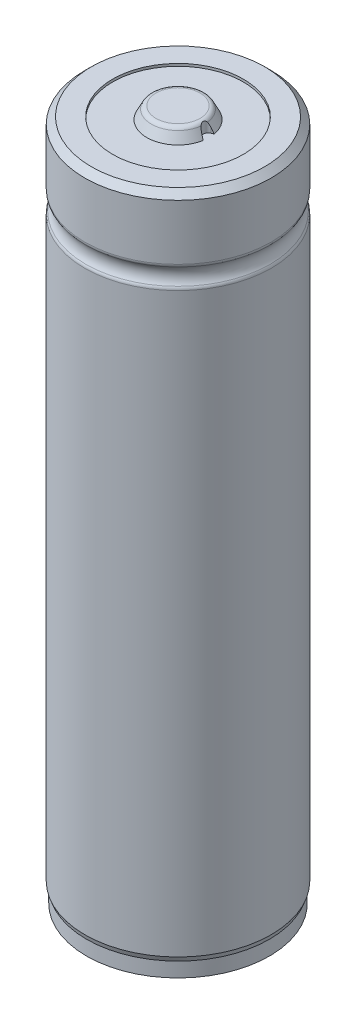
ISO-10303-21;
HEADER;
FILE_DESCRIPTION(('STEP AP214'),'2;1');
FILE_NAME('part.step','',(''),(''),'','','');
FILE_SCHEMA(('AUTOMOTIVE_DESIGN { 1 0 10303 214 1 1 1 1 }'));
ENDSEC;
DATA;
#1=APPLICATION_CONTEXT('core data for automotive mechanical design processes');
#2=APPLICATION_PROTOCOL_DEFINITION('international standard','automotive_design',2000,#1);
#3=PRODUCT_CONTEXT('',#1,'mechanical');
#4=PRODUCT('Part','Part','',(#3));
#5=PRODUCT_RELATED_PRODUCT_CATEGORY('part','',(#4));
#6=PRODUCT_DEFINITION_FORMATION('','',#4);
#7=PRODUCT_DEFINITION_CONTEXT('part definition',#1,'design');
#8=PRODUCT_DEFINITION('design','',#6,#7);
#9=PRODUCT_DEFINITION_SHAPE('','',#8);
#10=(LENGTH_UNIT() NAMED_UNIT(*) SI_UNIT(.MILLI.,.METRE.));
#11=(NAMED_UNIT(*) PLANE_ANGLE_UNIT() SI_UNIT($,.RADIAN.));
#12=(NAMED_UNIT(*) SI_UNIT($,.STERADIAN.) SOLID_ANGLE_UNIT());
#13=UNCERTAINTY_MEASURE_WITH_UNIT(LENGTH_MEASURE(1.E-05),#10,'distance_accuracy_value','');
#14=(GEOMETRIC_REPRESENTATION_CONTEXT(3) GLOBAL_UNCERTAINTY_ASSIGNED_CONTEXT((#13)) GLOBAL_UNIT_ASSIGNED_CONTEXT((#10,
#11,#12)) REPRESENTATION_CONTEXT('',''));
#15=CARTESIAN_POINT('',(0.,0.,0.));
#16=DIRECTION('',(0.,0.,1.));
#17=DIRECTION('',(1.,0.,0.));
#18=AXIS2_PLACEMENT_3D('',#15,#16,#17);
#19=CARTESIAN_POINT('',(0.,68.75,0.));
#20=DIRECTION('',(0.,-1.,0.));
#21=DIRECTION('',(0.,0.,-1.));
#22=AXIS2_PLACEMENT_3D('',#19,#20,#21);
#23=CONICAL_SURFACE('',#22,2.5,0.463647609000804);
#24=CARTESIAN_POINT('',(-2.83028946375603,68.0117993124896,0.470317269391405));
#25=CARTESIAN_POINT('',(-2.81138802981694,68.0513239860967,0.463469626931302));
#26=CARTESIAN_POINT('',(-2.79271843805804,68.0907780312502,0.455469184730546));
#27=CARTESIAN_POINT('',(-2.75602281370867,68.1691338817233,0.436923937337304));
#28=CARTESIAN_POINT('',(-2.73799405521771,68.208037453108,0.42639190981715));
#29=CARTESIAN_POINT('',(-2.70256382827487,68.2852928231361,0.40247751167182));
#30=CARTESIAN_POINT('',(-2.68516262751072,68.323644382221,0.389093941135765));
#31=CARTESIAN_POINT('',(-2.65962279932329,68.3805205674553,0.366433650471559));
#32=CARTESIAN_POINT('',(-2.65118286279864,68.3994170352769,0.358426192609236));
#33=CARTESIAN_POINT('',(-2.63453621746898,68.4368821136596,0.341432913478595));
#34=CARTESIAN_POINT('',(-2.62632963178436,68.4554505492575,0.332446587391));
#35=CARTESIAN_POINT('',(-2.61825894614491,68.4738067977492,0.322914489922038));
#36=B_SPLINE_CURVE_WITH_KNOTS('',3,(#24,#25,#26,#27,#28,#29,#30,#31,#32,#33,#34,#35),
.UNSPECIFIED.,.F.,.F.,(4,2,2,2,2,4),(0.,0.133037109670133,0.265416342601513,0.397851390263327,
0.464401396736106,0.530985888160825),.UNSPECIFIED.);
#37=CARTESIAN_POINT('',(-2.83008946375603,68.0122175773087,0.47024505278981));
#38=VERTEX_POINT('',#37);
#39=CARTESIAN_POINT('',(-2.61834688436459,68.47360679775,0.323018419483759));
#40=VERTEX_POINT('',#39);
#41=EDGE_CURVE('E66',#38,#40,#36,.T.);
#42=ORIENTED_EDGE('',*,*,#41,.F.);
#43=CARTESIAN_POINT('',(-3.05091495987479,67.5498,0.550034469476448));
#44=CARTESIAN_POINT('',(-3.0141129104437,67.6269584933717,0.536737028245294));
#45=CARTESIAN_POINT('',(-2.97729309442779,67.7041073947059,0.5234331675315));
#46=CARTESIAN_POINT('',(-2.90361792905504,67.858386013658,0.496812607076733));
#47=CARTESIAN_POINT('',(-2.86676257969803,67.9355157312758,0.483495907335699));
#48=CARTESIAN_POINT('',(-2.82988946375604,68.0126358568561,0.470172788111966));
#49=B_SPLINE_CURVE_WITH_KNOTS('',3,(#43,#44,#45,#46,#47,#48),.UNSPECIFIED.,.F.,.F.,(4,2,4),(0.,
0.259541520465805,0.519083042138592),.UNSPECIFIED.);
#50=CARTESIAN_POINT('',(-3.05081956201936,67.55,0.55));
#51=VERTEX_POINT('',#50);
#52=EDGE_CURVE('E120',#51,#38,#49,.T.);
#53=ORIENTED_EDGE('',*,*,#52,.F.);
#54=CARTESIAN_POINT('',(0.,67.55,0.));
#55=DIRECTION('',(0.,1.,0.));
#56=DIRECTION('',(0.,0.,1.));
#57=AXIS2_PLACEMENT_3D('',#54,#55,#56);
#58=CIRCLE('',#57,3.1);
#59=CARTESIAN_POINT('',(3.05081956201936,67.55,0.55));
#60=VERTEX_POINT('',#59);
#61=EDGE_CURVE('E134',#51,#60,#58,.T.);
#62=ORIENTED_EDGE('',*,*,#61,.T.);
#63=CARTESIAN_POINT('',(2.82988946375603,68.0126358568561,0.470172788111964));
#64=CARTESIAN_POINT('',(2.86676257969803,67.9355157312758,0.483495907335698));
#65=CARTESIAN_POINT('',(2.90361792905504,67.858386013658,0.496812607076732));
#66=CARTESIAN_POINT('',(2.97729309442779,67.7041073947059,0.5234331675315));
#67=CARTESIAN_POINT('',(3.01411291044369,67.6269584933717,0.536737028245293));
#68=CARTESIAN_POINT('',(3.05091495987478,67.5498,0.550034469476447));
#69=B_SPLINE_CURVE_WITH_KNOTS('',3,(#63,#64,#65,#66,#67,#68),.UNSPECIFIED.,.F.,.F.,(4,2,4),(0.,
0.259541521672801,0.519083042138605),.UNSPECIFIED.);
#70=CARTESIAN_POINT('',(2.83008946375603,68.0122175773087,0.47024505278981));
#71=VERTEX_POINT('',#70);
#72=EDGE_CURVE('E248',#71,#60,#69,.T.);
#73=ORIENTED_EDGE('',*,*,#72,.F.);
#74=CARTESIAN_POINT('',(2.61825894614492,68.4738067977492,0.322914489922042));
#75=CARTESIAN_POINT('',(2.62632963178437,68.4554505492575,0.332446587391003));
#76=CARTESIAN_POINT('',(2.63453621746898,68.4368821136596,0.341432913478597));
#77=CARTESIAN_POINT('',(2.65118286279865,68.3994170352769,0.358426192609238));
#78=CARTESIAN_POINT('',(2.6596227993233,68.3805205674553,0.366433650471562));
#79=CARTESIAN_POINT('',(2.68516262751072,68.323644382221,0.389093941135768));
#80=CARTESIAN_POINT('',(2.70256382827488,68.2852928231361,0.402477511671821));
#81=CARTESIAN_POINT('',(2.73799405521771,68.208037453108,0.426391909817149));
#82=CARTESIAN_POINT('',(2.75602281370866,68.1691338817233,0.4369239373373));
#83=CARTESIAN_POINT('',(2.79271843805804,68.0907780312502,0.455469184730546));
#84=CARTESIAN_POINT('',(2.81138802981696,68.0513239860967,0.46346962693131));
#85=CARTESIAN_POINT('',(2.8302894637561,68.0117993124896,0.470317269391429));
#86=B_SPLINE_CURVE_WITH_KNOTS('',3,(#74,#75,#76,#77,#78,#79,#80,#81,#82,#83,#84,#85),
.UNSPECIFIED.,.F.,.F.,(4,2,2,2,2,4),(0.,0.0665844914247162,0.13313449789751,0.265569545559309,
0.397948778490673,0.530985888160818),.UNSPECIFIED.);
#87=CARTESIAN_POINT('',(2.61834688436459,68.47360679775,0.323018419483764));
#88=VERTEX_POINT('',#87);
#89=EDGE_CURVE('E216',#88,#71,#86,.T.);
#90=ORIENTED_EDGE('',*,*,#89,.F.);
#91=CARTESIAN_POINT('',(0.,68.47360679775,0.));
#92=DIRECTION('',(0.,1.,0.));
#93=DIRECTION('',(0.,0.,1.));
#94=AXIS2_PLACEMENT_3D('',#91,#92,#93);
#95=CIRCLE('',#94,2.63819660112501);
#96=EDGE_CURVE('E174',#88,#40,#95,.F.);
#97=ORIENTED_EDGE('',*,*,#96,.T.);
#98=EDGE_LOOP('',(#42,#53,#62,#73,#90,#97));
#99=FACE_BOUND('',#98,.T.);
#100=ADVANCED_FACE('F38',(#99),#23,.T.);
#101=CARTESIAN_POINT('',(-2.61825894614455,68.47380679775,-0.322914489921608));
#102=CARTESIAN_POINT('',(-2.62632963178401,68.4554505492583,-0.332446587390604));
#103=CARTESIAN_POINT('',(-2.63453621746864,68.4368821136604,-0.341432913478231));
#104=CARTESIAN_POINT('',(-2.65118286279833,68.3994170352776,-0.35842619260893));
#105=CARTESIAN_POINT('',(-2.65962279932299,68.380520567456,-0.36643365047128));
#106=CARTESIAN_POINT('',(-2.68516262751045,68.3236443822216,-0.389093941135557));
#107=CARTESIAN_POINT('',(-2.70256382827464,68.2852928231366,-0.40247751167165));
#108=CARTESIAN_POINT('',(-2.73799405521754,68.2080374531084,-0.426391909817045));
#109=CARTESIAN_POINT('',(-2.75602281370852,68.1691338817236,-0.436923937337224));
#110=CARTESIAN_POINT('',(-2.79271843805797,68.0907780312504,-0.455469184730516));
#111=CARTESIAN_POINT('',(-2.81138802981692,68.0513239860968,-0.463469626931297));
#112=CARTESIAN_POINT('',(-2.8302894637561,68.0117993124896,-0.470317269391429));
#113=B_SPLINE_CURVE_WITH_KNOTS('',3,(#101,#102,#103,#104,#105,#106,#107,#108,#109,#110,#111,
#112),.UNSPECIFIED.,.F.,.F.,(4,2,2,2,2,4),(0.,0.066584491424852,0.133134497897757,
0.265569545559809,0.39794877849143,0.530985888161825),.UNSPECIFIED.);
#114=CARTESIAN_POINT('',(-2.61834688436459,68.47360679775,-0.323018419483764));
#115=VERTEX_POINT('',#114);
#116=CARTESIAN_POINT('',(-2.83008946375603,68.0122175773087,-0.470245052789805));
#117=VERTEX_POINT('',#116);
#118=EDGE_CURVE('E241',#115,#117,#113,.T.);
#119=ORIENTED_EDGE('',*,*,#118,.F.);
#120=CARTESIAN_POINT('',(2.61834688436459,68.47360679775,-0.323018419483759));
#121=VERTEX_POINT('',#120);
#122=EDGE_CURVE('E177',#115,#121,#95,.F.);
#123=ORIENTED_EDGE('',*,*,#122,.T.);
#124=CARTESIAN_POINT('',(2.83028946375603,68.0117993124896,-0.470317269391405));
#125=CARTESIAN_POINT('',(2.8113880298169,68.0513239860968,-0.463469626931289));
#126=CARTESIAN_POINT('',(2.79271843805797,68.0907780312504,-0.455469184730516));
#127=CARTESIAN_POINT('',(2.75602281370854,68.1691338817236,-0.43692393733723));
#128=CARTESIAN_POINT('',(2.73799405521755,68.2080374531084,-0.42639190981705));
#129=CARTESIAN_POINT('',(2.70256382827464,68.2852928231366,-0.402477511671653));
#130=CARTESIAN_POINT('',(2.68516262751046,68.3236443822216,-0.389093941135559));
#131=CARTESIAN_POINT('',(2.65962279932299,68.380520567456,-0.36643365047128));
#132=CARTESIAN_POINT('',(2.65118286279833,68.3994170352776,-0.358426192608931));
#133=CARTESIAN_POINT('',(2.63453621746863,68.4368821136604,-0.341432913478231));
#134=CARTESIAN_POINT('',(2.62632963178401,68.4554505492583,-0.332446587390603));
#135=CARTESIAN_POINT('',(2.61825894614455,68.47380679775,-0.322914489921605));
#136=B_SPLINE_CURVE_WITH_KNOTS('',3,(#124,#125,#126,#127,#128,#129,#130,#131,#132,#133,#134,
#135),.UNSPECIFIED.,.F.,.F.,(4,2,2,2,2,4),(0.,0.133037109670384,0.265416342602004,
0.397851390264072,0.464401396736978,0.530985888161832),.UNSPECIFIED.);
#137=CARTESIAN_POINT('',(2.83008946375603,68.0122175773087,-0.470245052789805));
#138=VERTEX_POINT('',#137);
#139=EDGE_CURVE('E59',#138,#121,#136,.T.);
#140=ORIENTED_EDGE('',*,*,#139,.F.);
#141=CARTESIAN_POINT('',(3.05091495987478,67.5498,-0.550034469476449));
#142=CARTESIAN_POINT('',(3.0141129104437,67.6269584933717,-0.536737028245295));
#143=CARTESIAN_POINT('',(2.97729309442779,67.7041073947059,-0.5234331675315));
#144=CARTESIAN_POINT('',(2.90361792905504,67.858386013658,-0.49681260707673));
#145=CARTESIAN_POINT('',(2.86676257969803,67.9355157312758,-0.483495907335695));
#146=CARTESIAN_POINT('',(2.82988946375603,68.0126358568561,-0.47017278811196));
#147=B_SPLINE_CURVE_WITH_KNOTS('',3,(#141,#142,#143,#144,#145,#146),.UNSPECIFIED.,.F.,.F.,(4,2,
4),(0.,0.259541520465806,0.519083042138608),.UNSPECIFIED.);
#148=CARTESIAN_POINT('',(3.05081956201936,67.55,-0.550000000000001));
#149=VERTEX_POINT('',#148);
#150=EDGE_CURVE('E121',#149,#138,#147,.T.);
#151=ORIENTED_EDGE('',*,*,#150,.F.);
#152=CARTESIAN_POINT('',(-3.05081956201936,67.55,-0.550000000000001));
#153=VERTEX_POINT('',#152);
#154=EDGE_CURVE('E127',#149,#153,#58,.T.);
#155=ORIENTED_EDGE('',*,*,#154,.T.);
#156=CARTESIAN_POINT('',(-2.82988946375603,68.0126358568561,-0.470172788111958));
#157=CARTESIAN_POINT('',(-2.86676257969802,67.9355157312759,-0.483495907335694));
#158=CARTESIAN_POINT('',(-2.90361792905504,67.858386013658,-0.496812607076729));
#159=CARTESIAN_POINT('',(-2.97729309442779,67.7041073947059,-0.523433167531499));
#160=CARTESIAN_POINT('',(-3.01411291044369,67.6269584933717,-0.536737028245294));
#161=CARTESIAN_POINT('',(-3.05091495987478,67.5498,-0.550034469476449));
#162=B_SPLINE_CURVE_WITH_KNOTS('',3,(#156,#157,#158,#159,#160,#161),.UNSPECIFIED.,.F.,.F.,(4,2,
4),(0.,0.259541521672816,0.519083042138621),.UNSPECIFIED.);
#163=EDGE_CURVE('E110',#117,#153,#162,.T.);
#164=ORIENTED_EDGE('',*,*,#163,.F.);
#165=EDGE_LOOP('',(#119,#123,#140,#151,#155,#164));
#166=FACE_BOUND('',#165,.T.);
#167=ADVANCED_FACE('F132',(#166),#23,.T.);
#168=CARTESIAN_POINT('',(0.,68.75,0.));
#169=DIRECTION('',(0.,1.,0.));
#170=DIRECTION('',(0.,0.,1.));
#171=AXIS2_PLACEMENT_3D('',#168,#169,#170);
#172=PLANE('',#171);
#173=CARTESIAN_POINT('',(0.,68.75,0.));
#174=DIRECTION('',(0.,1.,0.));
#175=DIRECTION('',(0.,0.,1.));
#176=AXIS2_PLACEMENT_3D('',#173,#174,#175);
#177=CIRCLE('',#176,2.19098300562505);
#178=CARTESIAN_POINT('',(0.,68.75,2.19098300562505));
#179=VERTEX_POINT('',#178);
#180=EDGE_CURVE('E171',#179,#179,#177,.T.);
#181=ORIENTED_EDGE('',*,*,#180,.T.);
#182=EDGE_LOOP('',(#181));
#183=FACE_BOUND('',#182,.T.);
#184=ADVANCED_FACE('F227',(#183),#172,.T.);
#185=CARTESIAN_POINT('',(-6.99999999999999,0.25,0.));
#186=DIRECTION('',(0.,-1.,0.));
#187=DIRECTION('',(0.,0.,-1.));
#188=AXIS2_PLACEMENT_3D('',#185,#186,#187);
#189=PLANE('',#188);
#190=CARTESIAN_POINT('',(0.,0.25,0.));
#191=DIRECTION('',(0.,1.,0.));
#192=DIRECTION('',(0.,0.,1.));
#193=AXIS2_PLACEMENT_3D('',#190,#191,#192);
#194=CIRCLE('',#193,6.99999999999999);
#195=CARTESIAN_POINT('',(0.,0.25,6.99999999999999));
#196=VERTEX_POINT('',#195);
#197=EDGE_CURVE('E162',#196,#196,#194,.T.);
#198=ORIENTED_EDGE('',*,*,#197,.F.);
#199=EDGE_LOOP('',(#198));
#200=FACE_BOUND('',#199,.T.);
#201=ADVANCED_FACE('F409',(#200),#189,.T.);
#202=CARTESIAN_POINT('',(0.,93.4227692625456,0.));
#203=DIRECTION('',(0.,1.,0.));
#204=DIRECTION('',(0.,0.,1.));
#205=AXIS2_PLACEMENT_3D('',#202,#203,#204);
#206=CYLINDRICAL_SURFACE('',#205,6.99999999999999);
#207=ORIENTED_EDGE('',*,*,#197,.T.);
#208=EDGE_LOOP('',(#207));
#209=FACE_BOUND('',#208,.T.);
#210=CARTESIAN_POINT('',(0.,0.,0.));
#211=DIRECTION('',(0.,1.,0.));
#212=DIRECTION('',(0.,0.,1.));
#213=AXIS2_PLACEMENT_3D('',#210,#211,#212);
#214=CIRCLE('',#213,6.99999999999999);
#215=CARTESIAN_POINT('',(0.,0.,6.99999999999999));
#216=VERTEX_POINT('',#215);
#217=EDGE_CURVE('E159',#216,#216,#214,.T.);
#218=ORIENTED_EDGE('',*,*,#217,.F.);
#219=EDGE_LOOP('',(#218));
#220=FACE_BOUND('',#219,.T.);
#221=ADVANCED_FACE('F487',(#209,#220),#206,.F.);
#222=CARTESIAN_POINT('',(-6.99999999999999,0.,0.));
#223=DIRECTION('',(0.,-1.,0.));
#224=DIRECTION('',(0.,0.,-1.));
#225=AXIS2_PLACEMENT_3D('',#222,#223,#224);
#226=PLANE('',#225);
#227=ORIENTED_EDGE('',*,*,#217,.T.);
#228=EDGE_LOOP('',(#227));
#229=FACE_BOUND('',#228,.T.);
#230=CARTESIAN_POINT('',(0.,0.,0.));
#231=DIRECTION('',(0.,1.,0.));
#232=DIRECTION('',(0.,0.,1.));
#233=AXIS2_PLACEMENT_3D('',#230,#231,#232);
#234=CIRCLE('',#233,9.1);
#235=CARTESIAN_POINT('',(0.,0.,9.1));
#236=VERTEX_POINT('',#235);
#237=EDGE_CURVE('E156',#236,#236,#234,.T.);
#238=ORIENTED_EDGE('',*,*,#237,.F.);
#239=EDGE_LOOP('',(#238));
#240=FACE_BOUND('',#239,.T.);
#241=ADVANCED_FACE('F494',(#229,#240),#226,.T.);
#242=CARTESIAN_POINT('',(0.,93.4227692625456,0.));
#243=DIRECTION('',(0.,1.,0.));
#244=DIRECTION('',(0.,0.,1.));
#245=AXIS2_PLACEMENT_3D('',#242,#243,#244);
#246=CYLINDRICAL_SURFACE('',#245,9.1);
#247=CARTESIAN_POINT('',(0.,1.45050451610906,0.));
#248=DIRECTION('',(0.,-1.,0.));
#249=DIRECTION('',(0.,0.,-1.));
#250=AXIS2_PLACEMENT_3D('',#247,#248,#249);
#251=CIRCLE('',#250,9.1);
#252=CARTESIAN_POINT('',(0.,1.45050451610906,-9.1));
#253=VERTEX_POINT('',#252);
#254=EDGE_CURVE('E165',#253,#253,#251,.T.);
#255=ORIENTED_EDGE('',*,*,#254,.T.);
#256=EDGE_LOOP('',(#255));
#257=FACE_BOUND('',#256,.T.);
#258=ORIENTED_EDGE('',*,*,#237,.T.);
#259=EDGE_LOOP('',(#258));
#260=FACE_BOUND('',#259,.T.);
#261=ADVANCED_FACE('F399',(#257,#260),#246,.T.);
#262=CARTESIAN_POINT('',(0.,93.4227692625456,0.));
#263=DIRECTION('',(0.,1.,0.));
#264=DIRECTION('',(0.,0.,1.));
#265=AXIS2_PLACEMENT_3D('',#262,#263,#264);
#266=CYLINDRICAL_SURFACE('',#265,9.275);
#267=CARTESIAN_POINT('',(0.,59.3697345444537,0.));
#268=DIRECTION('',(0.,-1.,0.));
#269=DIRECTION('',(0.,0.,-1.));
#270=AXIS2_PLACEMENT_3D('',#267,#268,#269);
#271=CIRCLE('',#270,9.275);
#272=CARTESIAN_POINT('',(0.,59.3697345444537,-9.275));
#273=VERTEX_POINT('',#272);
#274=EDGE_CURVE('E184',#273,#273,#271,.T.);
#275=ORIENTED_EDGE('',*,*,#274,.T.);
#276=EDGE_LOOP('',(#275));
#277=FACE_BOUND('',#276,.T.);
#278=CARTESIAN_POINT('',(0.,1.93131306451361,0.));
#279=DIRECTION('',(0.,1.,0.));
#280=DIRECTION('',(0.,0.,1.));
#281=AXIS2_PLACEMENT_3D('',#278,#279,#280);
#282=CIRCLE('',#281,9.275);
#283=CARTESIAN_POINT('',(0.,1.93131306451361,9.275));
#284=VERTEX_POINT('',#283);
#285=EDGE_CURVE('E168',#284,#284,#282,.T.);
#286=ORIENTED_EDGE('',*,*,#285,.T.);
#287=EDGE_LOOP('',(#286));
#288=FACE_BOUND('',#287,.T.);
#289=ADVANCED_FACE('F416',(#277,#288),#266,.T.);
#290=CARTESIAN_POINT('',(0.,60.5,0.));
#291=DIRECTION('',(0.,1.,0.));
#292=DIRECTION('',(0.,0.,1.));
#293=AXIS2_PLACEMENT_3D('',#290,#291,#292);
#294=TOROIDAL_SURFACE('',#293,10.2908333333333,1.39083333333334);
#295=CARTESIAN_POINT('',(0.,59.6686147883179,0.));
#296=DIRECTION('',(0.,1.,0.));
#297=DIRECTION('',(0.,0.,1.));
#298=AXIS2_PLACEMENT_3D('',#295,#296,#297);
#299=CIRCLE('',#298,9.17583737329242);
#300=CARTESIAN_POINT('',(0.,59.6686147883179,9.17583737329242));
#301=VERTEX_POINT('',#300);
#302=EDGE_CURVE('E181',#301,#301,#299,.T.);
#303=ORIENTED_EDGE('',*,*,#302,.T.);
#304=EDGE_LOOP('',(#303));
#305=FACE_BOUND('',#304,.T.);
#306=CARTESIAN_POINT('',(0.,61.331385211682,0.));
#307=DIRECTION('',(0.,-1.,0.));
#308=DIRECTION('',(0.,0.,-1.));
#309=AXIS2_PLACEMENT_3D('',#306,#307,#308);
#310=CIRCLE('',#309,9.17583737329244);
#311=CARTESIAN_POINT('',(0.,61.331385211682,-9.17583737329244));
#312=VERTEX_POINT('',#311);
#313=EDGE_CURVE('E178',#312,#312,#310,.T.);
#314=ORIENTED_EDGE('',*,*,#313,.T.);
#315=EDGE_LOOP('',(#314));
#316=FACE_BOUND('',#315,.T.);
#317=ADVANCED_FACE('F421',(#305,#316),#294,.F.);
#318=CARTESIAN_POINT('',(0.,93.4227692625456,0.));
#319=DIRECTION('',(0.,1.,0.));
#320=DIRECTION('',(0.,0.,1.));
#321=AXIS2_PLACEMENT_3D('',#318,#319,#320);
#322=CYLINDRICAL_SURFACE('',#321,9.275);
#323=CARTESIAN_POINT('',(0.,61.6302654555463,0.));
#324=DIRECTION('',(0.,-1.,0.));
#325=DIRECTION('',(0.,0.,-1.));
#326=AXIS2_PLACEMENT_3D('',#323,#324,#325);
#327=CIRCLE('',#326,9.275);
#328=CARTESIAN_POINT('',(0.,61.6302654555463,-9.275));
#329=VERTEX_POINT('',#328);
#330=EDGE_CURVE('E187',#329,#329,#327,.F.);
#331=ORIENTED_EDGE('',*,*,#330,.T.);
#332=EDGE_LOOP('',(#331));
#333=FACE_BOUND('',#332,.T.);
#334=CARTESIAN_POINT('',(0.,67.15,0.));
#335=DIRECTION('',(0.,1.,0.));
#336=DIRECTION('',(0.,0.,1.));
#337=AXIS2_PLACEMENT_3D('',#334,#335,#336);
#338=CIRCLE('',#337,9.275);
#339=CARTESIAN_POINT('',(0.,67.15,9.275));
#340=VERTEX_POINT('',#339);
#341=EDGE_CURVE('E153',#340,#340,#338,.T.);
#342=ORIENTED_EDGE('',*,*,#341,.F.);
#343=EDGE_LOOP('',(#342));
#344=FACE_BOUND('',#343,.T.);
#345=ADVANCED_FACE('F431',(#333,#344),#322,.T.);
#346=CARTESIAN_POINT('',(0.,67.8,0.));
#347=DIRECTION('',(0.,-1.,0.));
#348=DIRECTION('',(0.,0.,-1.));
#349=AXIS2_PLACEMENT_3D('',#346,#347,#348);
#350=CONICAL_SURFACE('',#349,8.62500000000093,0.785398163396732);
#351=ORIENTED_EDGE('',*,*,#341,.T.);
#352=EDGE_LOOP('',(#351));
#353=FACE_BOUND('',#352,.T.);
#354=CARTESIAN_POINT('',(0.,67.8,0.));
#355=DIRECTION('',(0.,1.,0.));
#356=DIRECTION('',(0.,0.,1.));
#357=AXIS2_PLACEMENT_3D('',#354,#355,#356);
#358=CIRCLE('',#357,8.62500000000093);
#359=CARTESIAN_POINT('',(0.,67.8,8.62500000000093));
#360=VERTEX_POINT('',#359);
#361=EDGE_CURVE('E150',#360,#360,#358,.T.);
#362=ORIENTED_EDGE('',*,*,#361,.F.);
#363=EDGE_LOOP('',(#362));
#364=FACE_BOUND('',#363,.T.);
#365=ADVANCED_FACE('F440',(#353,#364),#350,.T.);
#366=CARTESIAN_POINT('',(-6.5,67.8,0.));
#367=DIRECTION('',(0.,1.,0.));
#368=DIRECTION('',(0.,0.,1.));
#369=AXIS2_PLACEMENT_3D('',#366,#367,#368);
#370=PLANE('',#369);
#371=ORIENTED_EDGE('',*,*,#361,.T.);
#372=EDGE_LOOP('',(#371));
#373=FACE_BOUND('',#372,.T.);
#374=CARTESIAN_POINT('',(0.,67.8,0.));
#375=DIRECTION('',(0.,1.,0.));
#376=DIRECTION('',(0.,0.,1.));
#377=AXIS2_PLACEMENT_3D('',#374,#375,#376);
#378=CIRCLE('',#377,6.5);
#379=CARTESIAN_POINT('',(0.,67.8,6.5));
#380=VERTEX_POINT('',#379);
#381=EDGE_CURVE('E137',#380,#380,#378,.T.);
#382=ORIENTED_EDGE('',*,*,#381,.F.);
#383=EDGE_LOOP('',(#382));
#384=FACE_BOUND('',#383,.T.);
#385=ADVANCED_FACE('F451',(#373,#384),#370,.T.);
#386=CARTESIAN_POINT('',(0.,93.4227692625456,0.));
#387=DIRECTION('',(0.,1.,0.));
#388=DIRECTION('',(0.,0.,1.));
#389=AXIS2_PLACEMENT_3D('',#386,#387,#388);
#390=CYLINDRICAL_SURFACE('',#389,6.5);
#391=ORIENTED_EDGE('',*,*,#381,.T.);
#392=EDGE_LOOP('',(#391));
#393=FACE_BOUND('',#392,.T.);
#394=CARTESIAN_POINT('',(0.,67.55,0.));
#395=DIRECTION('',(0.,1.,0.));
#396=DIRECTION('',(0.,0.,1.));
#397=AXIS2_PLACEMENT_3D('',#394,#395,#396);
#398=CIRCLE('',#397,6.5);
#399=CARTESIAN_POINT('',(0.,67.55,6.5));
#400=VERTEX_POINT('',#399);
#401=EDGE_CURVE('E133',#400,#400,#398,.T.);
#402=ORIENTED_EDGE('',*,*,#401,.F.);
#403=EDGE_LOOP('',(#402));
#404=FACE_BOUND('',#403,.T.);
#405=ADVANCED_FACE('F355',(#393,#404),#390,.F.);
#406=CARTESIAN_POINT('',(-6.5,67.55,0.));
#407=DIRECTION('',(0.,1.,0.));
#408=DIRECTION('',(0.,0.,1.));
#409=AXIS2_PLACEMENT_3D('',#406,#407,#408);
#410=PLANE('',#409);
#411=ORIENTED_EDGE('',*,*,#401,.T.);
#412=EDGE_LOOP('',(#411));
#413=FACE_BOUND('',#412,.T.);
#414=ORIENTED_EDGE('',*,*,#154,.F.);
#415=DIRECTION('',(0.94049010557961,0.,-0.339821072487942));
#416=VECTOR('',#415,1.);
#417=CARTESIAN_POINT('',(2.83008946375603,67.55,-0.470245052789805));
#418=LINE('',#417,#416);
#419=CARTESIAN_POINT('',(2.83008946375603,67.55,-0.470245052789805));
#420=VERTEX_POINT('',#419);
#421=EDGE_CURVE('E295',#420,#149,#418,.T.);
#422=ORIENTED_EDGE('',*,*,#421,.F.);
#423=CARTESIAN_POINT('',(3.,67.55,0.));
#424=DIRECTION('',(0.,1.,0.));
#425=DIRECTION('',(0.,0.,1.));
#426=AXIS2_PLACEMENT_3D('',#423,#424,#425);
#427=CIRCLE('',#426,0.500000000000002);
#428=CARTESIAN_POINT('',(2.83008946375603,67.55,0.47024505278981));
#429=VERTEX_POINT('',#428);
#430=EDGE_CURVE('E296',#429,#420,#427,.F.);
#431=ORIENTED_EDGE('',*,*,#430,.F.);
#432=DIRECTION('',(-0.940490105579617,0.,-0.339821072487922));
#433=VECTOR('',#432,1.);
#434=CARTESIAN_POINT('',(2.83008946375603,67.55,0.47024505278981));
#435=LINE('',#434,#433);
#436=EDGE_CURVE('E217',#60,#429,#435,.T.);
#437=ORIENTED_EDGE('',*,*,#436,.F.);
#438=ORIENTED_EDGE('',*,*,#61,.F.);
#439=DIRECTION('',(-0.940490105579617,0.,0.339821072487922));
#440=VECTOR('',#439,1.);
#441=CARTESIAN_POINT('',(-2.83008946375603,67.55,0.47024505278981));
#442=LINE('',#441,#440);
#443=CARTESIAN_POINT('',(-2.83008946375603,67.55,0.47024505278981));
#444=VERTEX_POINT('',#443);
#445=EDGE_CURVE('E304',#444,#51,#442,.T.);
#446=ORIENTED_EDGE('',*,*,#445,.F.);
#447=CARTESIAN_POINT('',(-3.,67.55,0.));
#448=DIRECTION('',(0.,1.,0.));
#449=DIRECTION('',(0.,0.,1.));
#450=AXIS2_PLACEMENT_3D('',#447,#448,#449);
#451=CIRCLE('',#450,0.500000000000002);
#452=CARTESIAN_POINT('',(-2.83008946375603,67.55,-0.470245052789805));
#453=VERTEX_POINT('',#452);
#454=EDGE_CURVE('E129',#453,#444,#451,.F.);
#455=ORIENTED_EDGE('',*,*,#454,.F.);
#456=DIRECTION('',(0.94049010557961,0.,0.339821072487942));
#457=VECTOR('',#456,1.);
#458=CARTESIAN_POINT('',(-2.83008946375603,67.55,-0.470245052789805));
#459=LINE('',#458,#457);
#460=EDGE_CURVE('E113',#153,#453,#459,.T.);
#461=ORIENTED_EDGE('',*,*,#460,.F.);
#462=EDGE_LOOP('',(#414,#422,#431,#437,#438,#446,#455,#461));
#463=FACE_BOUND('',#462,.T.);
#464=ADVANCED_FACE('F125',(#413,#463),#410,.T.);
#465=CARTESIAN_POINT('',(0.,2.,0.));
#466=DIRECTION('',(0.,1.,0.));
#467=DIRECTION('',(0.,0.,1.));
#468=AXIS2_PLACEMENT_3D('',#465,#466,#467);
#469=CONICAL_SURFACE('',#468,9.3,0.349065850398864);
#470=ORIENTED_EDGE('',*,*,#254,.F.);
#471=EDGE_LOOP('',(#470));
#472=FACE_BOUND('',#471,.T.);
#473=ORIENTED_EDGE('',*,*,#285,.F.);
#474=EDGE_LOOP('',(#473));
#475=FACE_BOUND('',#474,.T.);
#476=ADVANCED_FACE('F229',(#472,#475),#469,.T.);
#477=CARTESIAN_POINT('',(0.,68.25,0.));
#478=DIRECTION('',(0.,1.,0.));
#479=DIRECTION('',(0.,0.,1.));
#480=AXIS2_PLACEMENT_3D('',#477,#478,#479);
#481=TOROIDAL_SURFACE('',#480,2.19098300562505,0.5);
#482=CARTESIAN_POINT('',(-2.6184347767672,68.47340679775,0.323122237580924));
#483=CARTESIAN_POINT('',(-2.61138913974592,68.4895177962082,0.314811518494026));
#484=CARTESIAN_POINT('',(-2.60375470680612,68.504731691211,0.305237264603634));
#485=CARTESIAN_POINT('',(-2.58803094481831,68.5330081896768,0.283651155670677));
#486=CARTESIAN_POINT('',(-2.57994222310283,68.5460735777406,0.271642501589006));
#487=CARTESIAN_POINT('',(-2.56398855521245,68.5697723619186,0.245218684694343));
#488=CARTESIAN_POINT('',(-2.55612428519185,68.5803989749758,0.230796998282489));
#489=CARTESIAN_POINT('',(-2.54139420240643,68.5990552524437,0.199931594181185));
#490=CARTESIAN_POINT('',(-2.5345276113001,68.6070869473373,0.183489471426593));
#491=CARTESIAN_POINT('',(-2.52258749100916,68.6204121338158,0.149629752053119));
#492=CARTESIAN_POINT('',(-2.51746233296074,68.625787133368,0.13226215246647));
#493=CARTESIAN_POINT('',(-2.50906838183404,68.6343436324463,0.0965555731237795));
#494=CARTESIAN_POINT('',(-2.50580098957105,68.6375234771408,0.0782158717323504));
#495=CARTESIAN_POINT('',(-2.50123227385714,68.6419246677191,0.0401809989071521));
#496=CARTESIAN_POINT('',(-2.50002996181653,68.6430475471297,0.0204625349550263));
#497=CARTESIAN_POINT('',(-2.49997113022457,68.6431028003831,-0.0189846323542144));
#498=CARTESIAN_POINT('',(-2.50111524187177,68.6420345848114,-0.0387133370388668));
#499=CARTESIAN_POINT('',(-2.50575797734712,68.6375676005099,-0.0783320983497362));
#500=CARTESIAN_POINT('',(-2.50933693267522,68.6340892403345,-0.0982039947488629));
#501=CARTESIAN_POINT('',(-2.51866176217627,68.6245419700438,-0.136771459220856));
#502=CARTESIAN_POINT('',(-2.52440573896411,68.6184753276393,-0.155468040626433));
#503=CARTESIAN_POINT('',(-2.53735866449081,68.6037959937667,-0.190529506708812));
#504=CARTESIAN_POINT('',(-2.54451636650404,68.5952685614299,-0.206948907198271));
#505=CARTESIAN_POINT('',(-2.55974826813721,68.5755471328375,-0.237638716833655));
#506=CARTESIAN_POINT('',(-2.56782289686466,68.5643518853712,-0.251908112481792));
#507=CARTESIAN_POINT('',(-2.58329641639736,68.5406801670252,-0.276678341562));
#508=CARTESIAN_POINT('',(-2.59068391532975,68.5284370259382,-0.287411520833219));
#509=CARTESIAN_POINT('',(-2.60502230938592,68.5021812567358,-0.306820355938927));
#510=CARTESIAN_POINT('',(-2.61197306103079,68.4881680516283,-0.315495338191999));
#511=CARTESIAN_POINT('',(-2.6184347767672,68.47340679775,-0.323122237580924));
#512=B_SPLINE_CURVE_WITH_KNOTS('',3,(#482,#483,#484,#485,#486,#487,#488,#489,#490,#491,#492,
#493,#494,#495,#496,#497,#498,#499,#500,#501,#502,#503,#504,#505,#506,#507,#508,#509,#510,#511),
.UNSPECIFIED.,.F.,.F.,(4,2,2,2,2,2,2,2,2,2,2,2,2,2,4),(0.,0.0583004540505228,0.116524741107769,
0.174909058265181,0.233247579332473,0.289663735218071,0.346122374480706,0.405219376499319,
0.464332277963295,0.525496593032994,0.586607428983959,0.645813343613944,0.705047080778743,
0.758471639237812,0.811913657786419),.UNSPECIFIED.);
#513=EDGE_CURVE('E12',#40,#115,#512,.T.);
#514=ORIENTED_EDGE('',*,*,#513,.F.);
#515=ORIENTED_EDGE('',*,*,#96,.F.);
#516=CARTESIAN_POINT('',(2.6184347767672,68.47340679775,-0.323122237580924));
#517=CARTESIAN_POINT('',(2.61138913974592,68.4895177962082,-0.314811518494026));
#518=CARTESIAN_POINT('',(2.60375470680612,68.504731691211,-0.305237264603634));
#519=CARTESIAN_POINT('',(2.58803094481831,68.5330081896768,-0.283651155670677));
#520=CARTESIAN_POINT('',(2.57994222310283,68.5460735777406,-0.271642501589006));
#521=CARTESIAN_POINT('',(2.56398855521245,68.5697723619186,-0.245218684694343));
#522=CARTESIAN_POINT('',(2.55612428519185,68.5803989749758,-0.230796998282489));
#523=CARTESIAN_POINT('',(2.54139420240643,68.5990552524437,-0.199931594181185));
#524=CARTESIAN_POINT('',(2.5345276113001,68.6070869473373,-0.183489471426593));
#525=CARTESIAN_POINT('',(2.52258749100916,68.6204121338158,-0.149629752053119));
#526=CARTESIAN_POINT('',(2.51746233296074,68.625787133368,-0.13226215246647));
#527=CARTESIAN_POINT('',(2.50906838183404,68.6343436324463,-0.0965555731237795));
#528=CARTESIAN_POINT('',(2.50580098957105,68.6375234771408,-0.0782158717323504));
#529=CARTESIAN_POINT('',(2.50123227385714,68.6419246677191,-0.0401809989071521));
#530=CARTESIAN_POINT('',(2.50002996181653,68.6430475471297,-0.0204625349550263));
#531=CARTESIAN_POINT('',(2.49997113022457,68.6431028003831,0.0189846323542144));
#532=CARTESIAN_POINT('',(2.50111524187177,68.6420345848114,0.0387133370388668));
#533=CARTESIAN_POINT('',(2.50575797734712,68.6375676005099,0.0783320983497362));
#534=CARTESIAN_POINT('',(2.50933693267522,68.6340892403345,0.0982039947488629));
#535=CARTESIAN_POINT('',(2.51866176217627,68.6245419700438,0.136771459220856));
#536=CARTESIAN_POINT('',(2.52440573896411,68.6184753276393,0.155468040626433));
#537=CARTESIAN_POINT('',(2.53735866449081,68.6037959937667,0.190529506708812));
#538=CARTESIAN_POINT('',(2.54451636650404,68.5952685614299,0.206948907198271));
#539=CARTESIAN_POINT('',(2.55974826813721,68.5755471328375,0.237638716833655));
#540=CARTESIAN_POINT('',(2.56782289686466,68.5643518853712,0.251908112481792));
#541=CARTESIAN_POINT('',(2.58329641639736,68.5406801670252,0.276678341562));
#542=CARTESIAN_POINT('',(2.59068391532975,68.5284370259382,0.287411520833219));
#543=CARTESIAN_POINT('',(2.60502230938592,68.5021812567358,0.306820355938927));
#544=CARTESIAN_POINT('',(2.61197306103079,68.4881680516283,0.315495338191999));
#545=CARTESIAN_POINT('',(2.6184347767672,68.47340679775,0.323122237580924));
#546=B_SPLINE_CURVE_WITH_KNOTS('',3,(#516,#517,#518,#519,#520,#521,#522,#523,#524,#525,#526,
#527,#528,#529,#530,#531,#532,#533,#534,#535,#536,#537,#538,#539,#540,#541,#542,#543,#544,#545),
.UNSPECIFIED.,.F.,.F.,(4,2,2,2,2,2,2,2,2,2,2,2,2,2,4),(0.,0.0583004540505228,0.116524741107769,
0.174909058265181,0.233247579332473,0.289663735218071,0.346122374480706,0.405219376499319,
0.464332277963295,0.525496593032994,0.586607428983959,0.645813343613944,0.705047080778743,
0.758471639237812,0.811913657786419),.UNSPECIFIED.);
#547=EDGE_CURVE('E52',#121,#88,#546,.T.);
#548=ORIENTED_EDGE('',*,*,#547,.F.);
#549=ORIENTED_EDGE('',*,*,#122,.F.);
#550=EDGE_LOOP('',(#514,#515,#548,#549));
#551=FACE_BOUND('',#550,.T.);
#552=ORIENTED_EDGE('',*,*,#180,.F.);
#553=EDGE_LOOP('',(#552));
#554=FACE_BOUND('',#553,.T.);
#555=ADVANCED_FACE('F194',(#551,#554),#481,.T.);
#556=CARTESIAN_POINT('',(0.,59.3697345444537,0.));
#557=DIRECTION('',(0.,-1.,0.));
#558=DIRECTION('',(0.,0.,-1.));
#559=AXIS2_PLACEMENT_3D('',#556,#557,#558);
#560=TOROIDAL_SURFACE('',#559,8.77500000000016,0.5);
#561=ORIENTED_EDGE('',*,*,#274,.F.);
#562=EDGE_LOOP('',(#561));
#563=FACE_BOUND('',#562,.T.);
#564=ORIENTED_EDGE('',*,*,#302,.F.);
#565=EDGE_LOOP('',(#564));
#566=FACE_BOUND('',#565,.T.);
#567=ADVANCED_FACE('F374',(#563,#566),#560,.T.);
#568=CARTESIAN_POINT('',(0.,61.6302654555463,0.));
#569=DIRECTION('',(0.,-1.,0.));
#570=DIRECTION('',(0.,0.,-1.));
#571=AXIS2_PLACEMENT_3D('',#568,#569,#570);
#572=TOROIDAL_SURFACE('',#571,8.77500000000016,0.5);
#573=ORIENTED_EDGE('',*,*,#313,.F.);
#574=EDGE_LOOP('',(#573));
#575=FACE_BOUND('',#574,.T.);
#576=ORIENTED_EDGE('',*,*,#330,.F.);
#577=EDGE_LOOP('',(#576));
#578=FACE_BOUND('',#577,.T.);
#579=ADVANCED_FACE('F40',(#575,#578),#572,.T.);
#580=CARTESIAN_POINT('',(3.,66.2970035913858,0.));
#581=DIRECTION('',(0.,1.,0.));
#582=DIRECTION('',(0.,0.,1.));
#583=AXIS2_PLACEMENT_3D('',#580,#581,#582);
#584=CYLINDRICAL_SURFACE('',#583,0.500000000000002);
#585=ORIENTED_EDGE('',*,*,#89,.T.);
#586=DIRECTION('',(0.,1.,0.));
#587=VECTOR('',#586,1.);
#588=CARTESIAN_POINT('',(2.83008946375603,66.2970035913858,0.47024505278981));
#589=LINE('',#588,#587);
#590=EDGE_CURVE('E289',#429,#71,#589,.T.);
#591=ORIENTED_EDGE('',*,*,#590,.F.);
#592=ORIENTED_EDGE('',*,*,#430,.T.);
#593=DIRECTION('',(0.,1.,0.));
#594=VECTOR('',#593,1.);
#595=CARTESIAN_POINT('',(2.83008946375603,66.2970035913858,-0.470245052789805));
#596=LINE('',#595,#594);
#597=EDGE_CURVE('E293',#420,#138,#596,.T.);
#598=ORIENTED_EDGE('',*,*,#597,.T.);
#599=ORIENTED_EDGE('',*,*,#139,.T.);
#600=ORIENTED_EDGE('',*,*,#547,.T.);
#601=EDGE_LOOP('',(#585,#591,#592,#598,#599,#600));
#602=FACE_BOUND('',#601,.T.);
#603=ADVANCED_FACE('F197',(#602),#584,.F.);
#604=CARTESIAN_POINT('',(2.83008946375603,66.2970035913858,-0.470245052789805));
#605=DIRECTION('',(-0.339821072487942,0.,-0.94049010557961));
#606=DIRECTION('',(-0.94049010557961,0.,0.339821072487942));
#607=AXIS2_PLACEMENT_3D('',#604,#605,#606);
#608=PLANE('',#607);
#609=ORIENTED_EDGE('',*,*,#150,.T.);
#610=ORIENTED_EDGE('',*,*,#597,.F.);
#611=ORIENTED_EDGE('',*,*,#421,.T.);
#612=EDGE_LOOP('',(#609,#610,#611));
#613=FACE_BOUND('',#612,.T.);
#614=ADVANCED_FACE('F202',(#613),#608,.F.);
#615=CARTESIAN_POINT('',(2.83008946375603,66.2970035913858,0.47024505278981));
#616=DIRECTION('',(-0.339821072487922,0.,0.940490105579617));
#617=DIRECTION('',(0.940490105579617,0.,0.339821072487922));
#618=AXIS2_PLACEMENT_3D('',#615,#616,#617);
#619=PLANE('',#618);
#620=ORIENTED_EDGE('',*,*,#72,.T.);
#621=ORIENTED_EDGE('',*,*,#436,.T.);
#622=ORIENTED_EDGE('',*,*,#590,.T.);
#623=EDGE_LOOP('',(#620,#621,#622));
#624=FACE_BOUND('',#623,.T.);
#625=ADVANCED_FACE('F203',(#624),#619,.F.);
#626=CARTESIAN_POINT('',(-3.,66.2970035913858,0.));
#627=DIRECTION('',(0.,1.,0.));
#628=DIRECTION('',(0.,0.,1.));
#629=AXIS2_PLACEMENT_3D('',#626,#627,#628);
#630=CYLINDRICAL_SURFACE('',#629,0.500000000000002);
#631=ORIENTED_EDGE('',*,*,#118,.T.);
#632=DIRECTION('',(0.,1.,0.));
#633=VECTOR('',#632,1.);
#634=CARTESIAN_POINT('',(-2.83008946375603,66.2970035913858,-0.470245052789805));
#635=LINE('',#634,#633);
#636=EDGE_CURVE('E116',#453,#117,#635,.T.);
#637=ORIENTED_EDGE('',*,*,#636,.F.);
#638=ORIENTED_EDGE('',*,*,#454,.T.);
#639=DIRECTION('',(0.,1.,0.));
#640=VECTOR('',#639,1.);
#641=CARTESIAN_POINT('',(-2.83008946375603,66.2970035913858,0.47024505278981));
#642=LINE('',#641,#640);
#643=EDGE_CURVE('E302',#444,#38,#642,.T.);
#644=ORIENTED_EDGE('',*,*,#643,.T.);
#645=ORIENTED_EDGE('',*,*,#41,.T.);
#646=ORIENTED_EDGE('',*,*,#513,.T.);
#647=EDGE_LOOP('',(#631,#637,#638,#644,#645,#646));
#648=FACE_BOUND('',#647,.T.);
#649=ADVANCED_FACE('F267',(#648),#630,.F.);
#650=CARTESIAN_POINT('',(-2.83008946375603,66.2970035913858,0.47024505278981));
#651=DIRECTION('',(0.339821072487922,0.,0.940490105579617));
#652=DIRECTION('',(0.940490105579617,0.,-0.339821072487922));
#653=AXIS2_PLACEMENT_3D('',#650,#651,#652);
#654=PLANE('',#653);
#655=ORIENTED_EDGE('',*,*,#52,.T.);
#656=ORIENTED_EDGE('',*,*,#643,.F.);
#657=ORIENTED_EDGE('',*,*,#445,.T.);
#658=EDGE_LOOP('',(#655,#656,#657));
#659=FACE_BOUND('',#658,.T.);
#660=ADVANCED_FACE('F265',(#659),#654,.F.);
#661=CARTESIAN_POINT('',(-2.83008946375603,66.2970035913858,-0.470245052789805));
#662=DIRECTION('',(0.339821072487942,0.,-0.94049010557961));
#663=DIRECTION('',(-0.94049010557961,0.,-0.339821072487942));
#664=AXIS2_PLACEMENT_3D('',#661,#662,#663);
#665=PLANE('',#664);
#666=ORIENTED_EDGE('',*,*,#163,.T.);
#667=ORIENTED_EDGE('',*,*,#460,.T.);
#668=ORIENTED_EDGE('',*,*,#636,.T.);
#669=EDGE_LOOP('',(#666,#667,#668));
#670=FACE_BOUND('',#669,.T.);
#671=ADVANCED_FACE('F112',(#670),#665,.F.);
#672=CLOSED_SHELL('',(#100,#167,#184,#201,#221,#241,#261,#289,#317,#345,#365,#385,#405,#464,
#476,#555,#567,#579,#603,#614,#625,#649,#660,#671));
#673=MANIFOLD_SOLID_BREP('B2',#672);
#674=ADVANCED_BREP_SHAPE_REPRESENTATION('',(#18,#673),#14);
#675=SHAPE_DEFINITION_REPRESENTATION(#9,#674);
ENDSEC;
END-ISO-10303-21;
